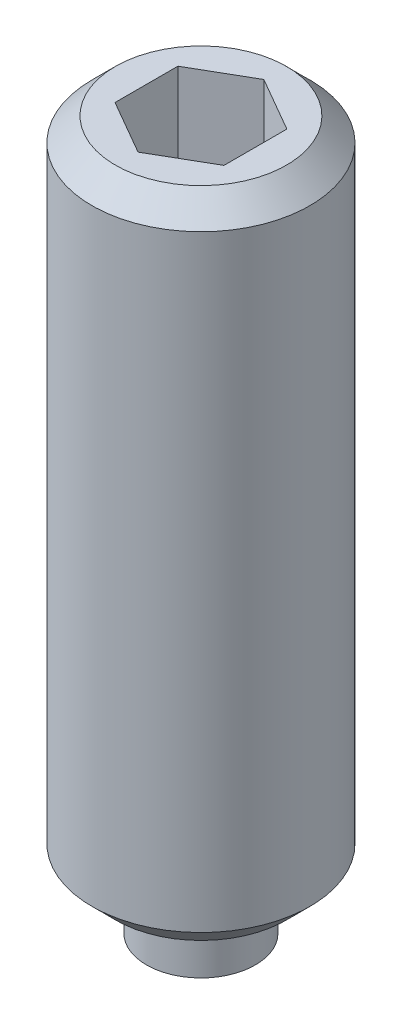
ISO-10303-21;
HEADER;
FILE_DESCRIPTION(('STEP AP214'),'2;1');
FILE_NAME('part.step','',(''),(''),'','','');
FILE_SCHEMA(('AUTOMOTIVE_DESIGN { 1 0 10303 214 1 1 1 1 }'));
ENDSEC;
DATA;
#1=APPLICATION_CONTEXT('core data for automotive mechanical design processes');
#2=APPLICATION_PROTOCOL_DEFINITION('international standard','automotive_design',2000,#1);
#3=PRODUCT_CONTEXT('',#1,'mechanical');
#4=PRODUCT('Part','Part','',(#3));
#5=PRODUCT_RELATED_PRODUCT_CATEGORY('part','',(#4));
#6=PRODUCT_DEFINITION_FORMATION('','',#4);
#7=PRODUCT_DEFINITION_CONTEXT('part definition',#1,'design');
#8=PRODUCT_DEFINITION('design','',#6,#7);
#9=PRODUCT_DEFINITION_SHAPE('','',#8);
#10=(LENGTH_UNIT() NAMED_UNIT(*) SI_UNIT(.MILLI.,.METRE.));
#11=(NAMED_UNIT(*) PLANE_ANGLE_UNIT() SI_UNIT($,.RADIAN.));
#12=(NAMED_UNIT(*) SI_UNIT($,.STERADIAN.) SOLID_ANGLE_UNIT());
#13=UNCERTAINTY_MEASURE_WITH_UNIT(LENGTH_MEASURE(1.E-05),#10,'distance_accuracy_value','');
#14=(GEOMETRIC_REPRESENTATION_CONTEXT(3) GLOBAL_UNCERTAINTY_ASSIGNED_CONTEXT((#13)) GLOBAL_UNIT_ASSIGNED_CONTEXT((#10,
#11,#12)) REPRESENTATION_CONTEXT('',''));
#15=CARTESIAN_POINT('',(0.,0.,0.));
#16=DIRECTION('',(0.,0.,1.));
#17=DIRECTION('',(1.,0.,0.));
#18=AXIS2_PLACEMENT_3D('',#15,#16,#17);
#19=CARTESIAN_POINT('',(0.78525,13.,0.));
#20=DIRECTION('',(0.,1.,0.));
#21=DIRECTION('',(1.,0.,0.));
#22=AXIS2_PLACEMENT_3D('',#19,#20,#21);
#23=PLANE('',#22);
#24=DIRECTION('',(-0.866025403784439,0.,-0.5));
#25=VECTOR('',#24,1.);
#26=CARTESIAN_POINT('',(-0.45553125,13.,0.891699448567465));
#27=LINE('',#26,#25);
#28=CARTESIAN_POINT('',(0.,13.,1.15470053837925));
#29=VERTEX_POINT('',#28);
#30=CARTESIAN_POINT('',(-1.,13.,0.577350269189626));
#31=VERTEX_POINT('',#30);
#32=EDGE_CURVE('E192',#29,#31,#27,.T.);
#33=ORIENTED_EDGE('',*,*,#32,.T.);
#34=DIRECTION('',(0.,0.,-1.));
#35=VECTOR('',#34,1.);
#36=CARTESIAN_POINT('',(-1.,13.,-0.288675134594813));
#37=LINE('',#36,#35);
#38=CARTESIAN_POINT('',(-1.,13.,-0.577350269189626));
#39=VERTEX_POINT('',#38);
#40=EDGE_CURVE('E11',#31,#39,#37,.T.);
#41=ORIENTED_EDGE('',*,*,#40,.T.);
#42=DIRECTION('',(0.866025403784439,0.,-0.5));
#43=VECTOR('',#42,1.);
#44=CARTESIAN_POINT('',(0.04446875,13.,-1.18037458316228));
#45=LINE('',#44,#43);
#46=CARTESIAN_POINT('',(0.,13.,-1.15470053837925));
#47=VERTEX_POINT('',#46);
#48=EDGE_CURVE('E204',#39,#47,#45,.T.);
#49=ORIENTED_EDGE('',*,*,#48,.T.);
#50=DIRECTION('',(0.866025403784439,0.,0.5));
#51=VECTOR('',#50,1.);
#52=CARTESIAN_POINT('',(1.04446875,13.,-0.5516762244066));
#53=LINE('',#52,#51);
#54=CARTESIAN_POINT('',(1.,13.,-0.577350269189626));
#55=VERTEX_POINT('',#54);
#56=EDGE_CURVE('E137',#47,#55,#53,.T.);
#57=ORIENTED_EDGE('',*,*,#56,.T.);
#58=DIRECTION('',(0.,0.,1.));
#59=VECTOR('',#58,1.);
#60=CARTESIAN_POINT('',(1.,13.,0.288675134594813));
#61=LINE('',#60,#59);
#62=CARTESIAN_POINT('',(1.,13.,0.577350269189626));
#63=VERTEX_POINT('',#62);
#64=EDGE_CURVE('E183',#55,#63,#61,.T.);
#65=ORIENTED_EDGE('',*,*,#64,.T.);
#66=DIRECTION('',(-0.866025403784439,0.,0.5));
#67=VECTOR('',#66,1.);
#68=CARTESIAN_POINT('',(0.54446875,13.,0.840351359001412));
#69=LINE('',#68,#67);
#70=EDGE_CURVE('E182',#63,#29,#69,.T.);
#71=ORIENTED_EDGE('',*,*,#70,.T.);
#72=EDGE_LOOP('',(#33,#41,#49,#57,#65,#71));
#73=FACE_BOUND('',#72,.T.);
#74=CARTESIAN_POINT('',(0.,13.,0.));
#75=DIRECTION('',(0.,1.,0.));
#76=DIRECTION('',(1.,0.,0.));
#77=AXIS2_PLACEMENT_3D('',#74,#75,#76);
#78=CIRCLE('',#77,1.5705);
#79=CARTESIAN_POINT('',(-1.5705,13.,0.));
#80=VERTEX_POINT('',#79);
#81=EDGE_CURVE('E210',#80,#80,#78,.T.);
#82=ORIENTED_EDGE('',*,*,#81,.T.);
#83=EDGE_LOOP('',(#82));
#84=FACE_BOUND('',#83,.T.);
#85=ADVANCED_FACE('F16',(#73,#84),#23,.T.);
#86=CARTESIAN_POINT('',(1.28525,1.,0.));
#87=DIRECTION('',(0.,-1.,0.));
#88=DIRECTION('',(0.,0.,-1.));
#89=AXIS2_PLACEMENT_3D('',#86,#87,#88);
#90=PLANE('',#89);
#91=CARTESIAN_POINT('',(0.,1.,0.));
#92=DIRECTION('',(0.,1.,0.));
#93=DIRECTION('',(1.,0.,0.));
#94=AXIS2_PLACEMENT_3D('',#91,#92,#93);
#95=CIRCLE('',#94,1.);
#96=CARTESIAN_POINT('',(-1.,1.,0.));
#97=VERTEX_POINT('',#96);
#98=EDGE_CURVE('E107',#97,#97,#95,.T.);
#99=ORIENTED_EDGE('',*,*,#98,.T.);
#100=EDGE_LOOP('',(#99));
#101=FACE_BOUND('',#100,.T.);
#102=CARTESIAN_POINT('',(0.,1.,0.));
#103=DIRECTION('',(0.,1.,0.));
#104=DIRECTION('',(1.,0.,0.));
#105=AXIS2_PLACEMENT_3D('',#102,#103,#104);
#106=CIRCLE('',#105,1.5705);
#107=CARTESIAN_POINT('',(-1.5705,1.,0.));
#108=VERTEX_POINT('',#107);
#109=EDGE_CURVE('E116',#108,#108,#106,.T.);
#110=ORIENTED_EDGE('',*,*,#109,.F.);
#111=EDGE_LOOP('',(#110));
#112=FACE_BOUND('',#111,.T.);
#113=ADVANCED_FACE('F264',(#101,#112),#90,.T.);
#114=CARTESIAN_POINT('',(0.5,0.,0.));
#115=DIRECTION('',(0.,-1.,0.));
#116=DIRECTION('',(0.,0.,-1.));
#117=AXIS2_PLACEMENT_3D('',#114,#115,#116);
#118=PLANE('',#117);
#119=CARTESIAN_POINT('',(0.,0.,0.));
#120=DIRECTION('',(0.,1.,0.));
#121=DIRECTION('',(1.,0.,0.));
#122=AXIS2_PLACEMENT_3D('',#119,#120,#121);
#123=CIRCLE('',#122,1.);
#124=CARTESIAN_POINT('',(-1.,0.,0.));
#125=VERTEX_POINT('',#124);
#126=EDGE_CURVE('E101',#125,#125,#123,.T.);
#127=ORIENTED_EDGE('',*,*,#126,.F.);
#128=EDGE_LOOP('',(#127));
#129=FACE_BOUND('',#128,.T.);
#130=ADVANCED_FACE('F269',(#129),#118,.T.);
#131=CARTESIAN_POINT('',(-1.,15.,-0.577350269189626));
#132=DIRECTION('',(-1.,0.,0.));
#133=DIRECTION('',(0.,0.,1.));
#134=AXIS2_PLACEMENT_3D('',#131,#132,#133);
#135=PLANE('',#134);
#136=ORIENTED_EDGE('',*,*,#40,.F.);
#137=DIRECTION('',(0.,-1.,0.));
#138=VECTOR('',#137,1.);
#139=CARTESIAN_POINT('',(-1.,15.,0.577350269189626));
#140=LINE('',#139,#138);
#141=CARTESIAN_POINT('',(-1.,11.,0.577350269189626));
#142=VERTEX_POINT('',#141);
#143=EDGE_CURVE('E201',#31,#142,#140,.T.);
#144=ORIENTED_EDGE('',*,*,#143,.T.);
#145=DIRECTION('',(0.,0.,1.));
#146=VECTOR('',#145,1.);
#147=CARTESIAN_POINT('',(-1.,11.,-0.577350269189626));
#148=LINE('',#147,#146);
#149=CARTESIAN_POINT('',(-1.,11.,0.));
#150=VERTEX_POINT('',#149);
#151=EDGE_CURVE('E126',#150,#142,#148,.T.);
#152=ORIENTED_EDGE('',*,*,#151,.F.);
#153=DIRECTION('',(0.,0.,1.));
#154=VECTOR('',#153,1.);
#155=CARTESIAN_POINT('',(-1.,11.,-0.577350269189626));
#156=LINE('',#155,#154);
#157=CARTESIAN_POINT('',(-1.,11.,-0.577350269189626));
#158=VERTEX_POINT('',#157);
#159=EDGE_CURVE('E165',#158,#150,#156,.T.);
#160=ORIENTED_EDGE('',*,*,#159,.F.);
#161=DIRECTION('',(0.,-1.,0.));
#162=VECTOR('',#161,1.);
#163=CARTESIAN_POINT('',(-1.,15.,-0.577350269189626));
#164=LINE('',#163,#162);
#165=EDGE_CURVE('E27',#39,#158,#164,.T.);
#166=ORIENTED_EDGE('',*,*,#165,.F.);
#167=EDGE_LOOP('',(#136,#144,#152,#160,#166));
#168=FACE_BOUND('',#167,.T.);
#169=ADVANCED_FACE('F290',(#168),#135,.F.);
#170=CARTESIAN_POINT('',(0.,15.,-1.15470053837925));
#171=DIRECTION('',(-0.5,0.,-0.866025403784439));
#172=DIRECTION('',(-0.866025403784439,0.,0.5));
#173=AXIS2_PLACEMENT_3D('',#170,#171,#172);
#174=PLANE('',#173);
#175=ORIENTED_EDGE('',*,*,#48,.F.);
#176=ORIENTED_EDGE('',*,*,#165,.T.);
#177=DIRECTION('',(-0.866025403784439,0.,0.5));
#178=VECTOR('',#177,1.);
#179=CARTESIAN_POINT('',(0.,11.,-1.15470053837925));
#180=LINE('',#179,#178);
#181=CARTESIAN_POINT('',(-0.5,11.,-0.866025403784439));
#182=VERTEX_POINT('',#181);
#183=EDGE_CURVE('E176',#182,#158,#180,.T.);
#184=ORIENTED_EDGE('',*,*,#183,.F.);
#185=DIRECTION('',(-0.866025403784439,0.,0.5));
#186=VECTOR('',#185,1.);
#187=CARTESIAN_POINT('',(0.,11.,-1.15470053837925));
#188=LINE('',#187,#186);
#189=CARTESIAN_POINT('',(0.,11.,-1.15470053837925));
#190=VERTEX_POINT('',#189);
#191=EDGE_CURVE('E164',#190,#182,#188,.T.);
#192=ORIENTED_EDGE('',*,*,#191,.F.);
#193=DIRECTION('',(0.,-1.,0.));
#194=VECTOR('',#193,1.);
#195=CARTESIAN_POINT('',(0.,15.,-1.15470053837925));
#196=LINE('',#195,#194);
#197=EDGE_CURVE('E220',#47,#190,#196,.T.);
#198=ORIENTED_EDGE('',*,*,#197,.F.);
#199=EDGE_LOOP('',(#175,#176,#184,#192,#198));
#200=FACE_BOUND('',#199,.T.);
#201=ADVANCED_FACE('F293',(#200),#174,.F.);
#202=CARTESIAN_POINT('',(-1.,15.,0.577350269189626));
#203=DIRECTION('',(-0.5,0.,0.866025403784439));
#204=DIRECTION('',(0.,1.,0.));
#205=AXIS2_PLACEMENT_3D('',#202,#203,#204);
#206=PLANE('',#205);
#207=ORIENTED_EDGE('',*,*,#32,.F.);
#208=DIRECTION('',(0.,-1.,0.));
#209=VECTOR('',#208,1.);
#210=CARTESIAN_POINT('',(0.,15.,1.15470053837925));
#211=LINE('',#210,#209);
#212=CARTESIAN_POINT('',(0.,11.,1.15470053837925));
#213=VERTEX_POINT('',#212);
#214=EDGE_CURVE('E186',#29,#213,#211,.T.);
#215=ORIENTED_EDGE('',*,*,#214,.T.);
#216=DIRECTION('',(0.866025403784439,0.,0.5));
#217=VECTOR('',#216,1.);
#218=CARTESIAN_POINT('',(-1.,11.,0.577350269189626));
#219=LINE('',#218,#217);
#220=CARTESIAN_POINT('',(-0.5,11.,0.866025403784439));
#221=VERTEX_POINT('',#220);
#222=EDGE_CURVE('E141',#221,#213,#219,.T.);
#223=ORIENTED_EDGE('',*,*,#222,.F.);
#224=DIRECTION('',(0.866025403784439,0.,0.5));
#225=VECTOR('',#224,1.);
#226=CARTESIAN_POINT('',(-1.,11.,0.577350269189626));
#227=LINE('',#226,#225);
#228=EDGE_CURVE('E129',#142,#221,#227,.T.);
#229=ORIENTED_EDGE('',*,*,#228,.F.);
#230=ORIENTED_EDGE('',*,*,#143,.F.);
#231=EDGE_LOOP('',(#207,#215,#223,#229,#230));
#232=FACE_BOUND('',#231,.T.);
#233=ADVANCED_FACE('F304',(#232),#206,.F.);
#234=CARTESIAN_POINT('',(0.,15.,1.15470053837925));
#235=DIRECTION('',(0.5,0.,0.866025403784439));
#236=DIRECTION('',(0.,-1.,0.));
#237=AXIS2_PLACEMENT_3D('',#234,#235,#236);
#238=PLANE('',#237);
#239=ORIENTED_EDGE('',*,*,#70,.F.);
#240=DIRECTION('',(0.,-1.,0.));
#241=VECTOR('',#240,1.);
#242=CARTESIAN_POINT('',(1.,15.,0.577350269189626));
#243=LINE('',#242,#241);
#244=CARTESIAN_POINT('',(1.,11.,0.577350269189626));
#245=VERTEX_POINT('',#244);
#246=EDGE_CURVE('E180',#63,#245,#243,.T.);
#247=ORIENTED_EDGE('',*,*,#246,.T.);
#248=DIRECTION('',(0.866025403784439,0.,-0.5));
#249=VECTOR('',#248,1.);
#250=CARTESIAN_POINT('',(0.,11.,1.15470053837925));
#251=LINE('',#250,#249);
#252=CARTESIAN_POINT('',(0.5,11.,0.866025403784439));
#253=VERTEX_POINT('',#252);
#254=EDGE_CURVE('E122',#253,#245,#251,.T.);
#255=ORIENTED_EDGE('',*,*,#254,.F.);
#256=DIRECTION('',(0.866025403784439,0.,-0.5));
#257=VECTOR('',#256,1.);
#258=CARTESIAN_POINT('',(0.,11.,1.15470053837925));
#259=LINE('',#258,#257);
#260=EDGE_CURVE('E130',#213,#253,#259,.T.);
#261=ORIENTED_EDGE('',*,*,#260,.F.);
#262=ORIENTED_EDGE('',*,*,#214,.F.);
#263=EDGE_LOOP('',(#239,#247,#255,#261,#262));
#264=FACE_BOUND('',#263,.T.);
#265=ADVANCED_FACE('F278',(#264),#238,.F.);
#266=CARTESIAN_POINT('',(1.,15.,0.577350269189626));
#267=DIRECTION('',(1.,0.,0.));
#268=DIRECTION('',(0.,1.,0.));
#269=AXIS2_PLACEMENT_3D('',#266,#267,#268);
#270=PLANE('',#269);
#271=ORIENTED_EDGE('',*,*,#64,.F.);
#272=DIRECTION('',(0.,-1.,0.));
#273=VECTOR('',#272,1.);
#274=CARTESIAN_POINT('',(1.,15.,-0.577350269189626));
#275=LINE('',#274,#273);
#276=CARTESIAN_POINT('',(1.,11.,-0.577350269189626));
#277=VERTEX_POINT('',#276);
#278=EDGE_CURVE('E155',#55,#277,#275,.T.);
#279=ORIENTED_EDGE('',*,*,#278,.T.);
#280=DIRECTION('',(0.,0.,-1.));
#281=VECTOR('',#280,1.);
#282=CARTESIAN_POINT('',(1.,11.,0.577350269189626));
#283=LINE('',#282,#281);
#284=CARTESIAN_POINT('',(1.,11.,0.));
#285=VERTEX_POINT('',#284);
#286=EDGE_CURVE('E169',#285,#277,#283,.T.);
#287=ORIENTED_EDGE('',*,*,#286,.F.);
#288=DIRECTION('',(0.,0.,-1.));
#289=VECTOR('',#288,1.);
#290=CARTESIAN_POINT('',(1.,11.,0.577350269189626));
#291=LINE('',#290,#289);
#292=EDGE_CURVE('E124',#245,#285,#291,.T.);
#293=ORIENTED_EDGE('',*,*,#292,.F.);
#294=ORIENTED_EDGE('',*,*,#246,.F.);
#295=EDGE_LOOP('',(#271,#279,#287,#293,#294));
#296=FACE_BOUND('',#295,.T.);
#297=ADVANCED_FACE('F274',(#296),#270,.F.);
#298=CARTESIAN_POINT('',(1.,15.,-0.577350269189626));
#299=DIRECTION('',(0.5,0.,-0.866025403784439));
#300=DIRECTION('',(0.,-1.,0.));
#301=AXIS2_PLACEMENT_3D('',#298,#299,#300);
#302=PLANE('',#301);
#303=ORIENTED_EDGE('',*,*,#56,.F.);
#304=ORIENTED_EDGE('',*,*,#197,.T.);
#305=DIRECTION('',(-0.866025403784439,0.,-0.5));
#306=VECTOR('',#305,1.);
#307=CARTESIAN_POINT('',(1.,11.,-0.577350269189626));
#308=LINE('',#307,#306);
#309=CARTESIAN_POINT('',(0.5,11.,-0.866025403784439));
#310=VERTEX_POINT('',#309);
#311=EDGE_CURVE('E160',#310,#190,#308,.T.);
#312=ORIENTED_EDGE('',*,*,#311,.F.);
#313=DIRECTION('',(-0.866025403784439,0.,-0.5));
#314=VECTOR('',#313,1.);
#315=CARTESIAN_POINT('',(1.,11.,-0.577350269189626));
#316=LINE('',#315,#314);
#317=EDGE_CURVE('E125',#277,#310,#316,.T.);
#318=ORIENTED_EDGE('',*,*,#317,.F.);
#319=ORIENTED_EDGE('',*,*,#278,.F.);
#320=EDGE_LOOP('',(#303,#304,#312,#318,#319));
#321=FACE_BOUND('',#320,.T.);
#322=ADVANCED_FACE('F277',(#321),#302,.F.);
#323=CARTESIAN_POINT('',(0.,11.,0.));
#324=DIRECTION('',(0.,1.,0.));
#325=DIRECTION('',(1.,0.,0.));
#326=AXIS2_PLACEMENT_3D('',#323,#324,#325);
#327=PLANE('',#326);
#328=CARTESIAN_POINT('',(0.,11.,0.));
#329=DIRECTION('',(0.,-1.,0.));
#330=DIRECTION('',(1.,0.,0.));
#331=AXIS2_PLACEMENT_3D('',#328,#329,#330);
#332=CIRCLE('',#331,1.);
#333=EDGE_CURVE('E170',#221,#150,#332,.T.);
#334=ORIENTED_EDGE('',*,*,#333,.T.);
#335=ORIENTED_EDGE('',*,*,#151,.T.);
#336=ORIENTED_EDGE('',*,*,#228,.T.);
#337=EDGE_LOOP('',(#334,#335,#336));
#338=FACE_BOUND('',#337,.T.);
#339=ADVANCED_FACE('F284',(#338),#327,.T.);
#340=CARTESIAN_POINT('',(0.,11.,0.));
#341=DIRECTION('',(0.,1.,0.));
#342=DIRECTION('',(1.,0.,0.));
#343=AXIS2_PLACEMENT_3D('',#340,#341,#342);
#344=PLANE('',#343);
#345=CARTESIAN_POINT('',(0.,11.,0.));
#346=DIRECTION('',(0.,-1.,0.));
#347=DIRECTION('',(1.,0.,0.));
#348=AXIS2_PLACEMENT_3D('',#345,#346,#347);
#349=CIRCLE('',#348,1.);
#350=EDGE_CURVE('E173',#253,#221,#349,.T.);
#351=ORIENTED_EDGE('',*,*,#350,.T.);
#352=ORIENTED_EDGE('',*,*,#222,.T.);
#353=ORIENTED_EDGE('',*,*,#260,.T.);
#354=EDGE_LOOP('',(#351,#352,#353));
#355=FACE_BOUND('',#354,.T.);
#356=ADVANCED_FACE('F280',(#355),#344,.T.);
#357=CARTESIAN_POINT('',(0.,11.,0.));
#358=DIRECTION('',(0.,1.,0.));
#359=DIRECTION('',(1.,0.,0.));
#360=AXIS2_PLACEMENT_3D('',#357,#358,#359);
#361=PLANE('',#360);
#362=CARTESIAN_POINT('',(0.,11.,0.));
#363=DIRECTION('',(0.,-1.,0.));
#364=DIRECTION('',(1.,0.,0.));
#365=AXIS2_PLACEMENT_3D('',#362,#363,#364);
#366=CIRCLE('',#365,1.);
#367=EDGE_CURVE('E106',#285,#253,#366,.T.);
#368=ORIENTED_EDGE('',*,*,#367,.T.);
#369=ORIENTED_EDGE('',*,*,#254,.T.);
#370=ORIENTED_EDGE('',*,*,#292,.T.);
#371=EDGE_LOOP('',(#368,#369,#370));
#372=FACE_BOUND('',#371,.T.);
#373=ADVANCED_FACE('F283',(#372),#361,.T.);
#374=CARTESIAN_POINT('',(0.,11.,0.));
#375=DIRECTION('',(0.,1.,0.));
#376=DIRECTION('',(1.,0.,0.));
#377=AXIS2_PLACEMENT_3D('',#374,#375,#376);
#378=PLANE('',#377);
#379=CARTESIAN_POINT('',(0.,11.,0.));
#380=DIRECTION('',(0.,-1.,0.));
#381=DIRECTION('',(1.,0.,0.));
#382=AXIS2_PLACEMENT_3D('',#379,#380,#381);
#383=CIRCLE('',#382,1.);
#384=EDGE_CURVE('E20',#310,#285,#383,.T.);
#385=ORIENTED_EDGE('',*,*,#384,.T.);
#386=ORIENTED_EDGE('',*,*,#286,.T.);
#387=ORIENTED_EDGE('',*,*,#317,.T.);
#388=EDGE_LOOP('',(#385,#386,#387));
#389=FACE_BOUND('',#388,.T.);
#390=ADVANCED_FACE('F285',(#389),#378,.T.);
#391=CARTESIAN_POINT('',(0.,11.,0.));
#392=DIRECTION('',(0.,1.,0.));
#393=DIRECTION('',(1.,0.,0.));
#394=AXIS2_PLACEMENT_3D('',#391,#392,#393);
#395=PLANE('',#394);
#396=CARTESIAN_POINT('',(0.,11.,0.));
#397=DIRECTION('',(0.,-1.,0.));
#398=DIRECTION('',(1.,0.,0.));
#399=AXIS2_PLACEMENT_3D('',#396,#397,#398);
#400=CIRCLE('',#399,1.);
#401=EDGE_CURVE('E228',#182,#310,#400,.T.);
#402=ORIENTED_EDGE('',*,*,#401,.T.);
#403=ORIENTED_EDGE('',*,*,#311,.T.);
#404=ORIENTED_EDGE('',*,*,#191,.T.);
#405=EDGE_LOOP('',(#402,#403,#404));
#406=FACE_BOUND('',#405,.T.);
#407=ADVANCED_FACE('F288',(#406),#395,.T.);
#408=CARTESIAN_POINT('',(0.,11.,0.));
#409=DIRECTION('',(0.,1.,0.));
#410=DIRECTION('',(1.,0.,0.));
#411=AXIS2_PLACEMENT_3D('',#408,#409,#410);
#412=PLANE('',#411);
#413=CARTESIAN_POINT('',(0.,11.,0.));
#414=DIRECTION('',(0.,-1.,0.));
#415=DIRECTION('',(1.,0.,0.));
#416=AXIS2_PLACEMENT_3D('',#413,#414,#415);
#417=CIRCLE('',#416,1.);
#418=EDGE_CURVE('E120',#150,#182,#417,.T.);
#419=ORIENTED_EDGE('',*,*,#418,.T.);
#420=ORIENTED_EDGE('',*,*,#183,.T.);
#421=ORIENTED_EDGE('',*,*,#159,.T.);
#422=EDGE_LOOP('',(#419,#420,#421));
#423=FACE_BOUND('',#422,.T.);
#424=ADVANCED_FACE('F18',(#423),#412,.T.);
#425=CARTESIAN_POINT('',(0.,10.7113248654052,0.));
#426=DIRECTION('',(0.,1.,0.));
#427=DIRECTION('',(1.,0.,0.));
#428=AXIS2_PLACEMENT_3D('',#425,#426,#427);
#429=CONICAL_SURFACE('',#428,0.5,1.0471975511966);
#430=CARTESIAN_POINT('',(0.,10.4226497308104,0.));
#431=VERTEX_POINT('',#430);
#432=VERTEX_LOOP('',#431);
#433=FACE_BOUND('',#432,.T.);
#434=ORIENTED_EDGE('',*,*,#367,.F.);
#435=ORIENTED_EDGE('',*,*,#384,.F.);
#436=ORIENTED_EDGE('',*,*,#401,.F.);
#437=ORIENTED_EDGE('',*,*,#418,.F.);
#438=ORIENTED_EDGE('',*,*,#333,.F.);
#439=ORIENTED_EDGE('',*,*,#350,.F.);
#440=EDGE_LOOP('',(#434,#435,#436,#437,#438,#439));
#441=FACE_BOUND('',#440,.T.);
#442=ADVANCED_FACE('F259',(#433,#441),#429,.F.);
#443=CARTESIAN_POINT('',(0.,0.5,0.));
#444=DIRECTION('',(0.,-1.,0.));
#445=DIRECTION('',(1.,0.,0.));
#446=AXIS2_PLACEMENT_3D('',#443,#444,#445);
#447=CYLINDRICAL_SURFACE('',#446,1.);
#448=ORIENTED_EDGE('',*,*,#126,.T.);
#449=EDGE_LOOP('',(#448));
#450=FACE_BOUND('',#449,.T.);
#451=ORIENTED_EDGE('',*,*,#98,.F.);
#452=EDGE_LOOP('',(#451));
#453=FACE_BOUND('',#452,.T.);
#454=ADVANCED_FACE('F102',(#450,#453),#447,.T.);
#455=CARTESIAN_POINT('',(0.,1.21475,0.));
#456=DIRECTION('',(0.,1.,0.));
#457=DIRECTION('',(1.,0.,0.));
#458=AXIS2_PLACEMENT_3D('',#455,#456,#457);
#459=CONICAL_SURFACE('',#458,1.78525,0.785398163397447);
#460=ORIENTED_EDGE('',*,*,#109,.T.);
#461=EDGE_LOOP('',(#460));
#462=FACE_BOUND('',#461,.T.);
#463=CARTESIAN_POINT('',(0.,1.4295,0.));
#464=DIRECTION('',(0.,1.,0.));
#465=DIRECTION('',(1.,0.,0.));
#466=AXIS2_PLACEMENT_3D('',#463,#464,#465);
#467=CIRCLE('',#466,2.);
#468=CARTESIAN_POINT('',(-2.,1.4295,0.));
#469=VERTEX_POINT('',#468);
#470=EDGE_CURVE('E159',#469,#469,#467,.T.);
#471=ORIENTED_EDGE('',*,*,#470,.F.);
#472=EDGE_LOOP('',(#471));
#473=FACE_BOUND('',#472,.T.);
#474=ADVANCED_FACE('F248',(#462,#473),#459,.T.);
#475=CARTESIAN_POINT('',(0.,7.,0.));
#476=DIRECTION('',(0.,-1.,0.));
#477=DIRECTION('',(1.,0.,0.));
#478=AXIS2_PLACEMENT_3D('',#475,#476,#477);
#479=CYLINDRICAL_SURFACE('',#478,2.);
#480=ORIENTED_EDGE('',*,*,#470,.T.);
#481=EDGE_LOOP('',(#480));
#482=FACE_BOUND('',#481,.T.);
#483=CARTESIAN_POINT('',(0.,12.5705,0.));
#484=DIRECTION('',(0.,1.,0.));
#485=DIRECTION('',(1.,0.,0.));
#486=AXIS2_PLACEMENT_3D('',#483,#484,#485);
#487=CIRCLE('',#486,2.);
#488=CARTESIAN_POINT('',(-2.,12.5705,0.));
#489=VERTEX_POINT('',#488);
#490=EDGE_CURVE('E212',#489,#489,#487,.T.);
#491=ORIENTED_EDGE('',*,*,#490,.F.);
#492=EDGE_LOOP('',(#491));
#493=FACE_BOUND('',#492,.T.);
#494=ADVANCED_FACE('F245',(#482,#493),#479,.T.);
#495=CARTESIAN_POINT('',(0.,12.78525,0.));
#496=DIRECTION('',(0.,-1.,0.));
#497=DIRECTION('',(1.,0.,0.));
#498=AXIS2_PLACEMENT_3D('',#495,#496,#497);
#499=CONICAL_SURFACE('',#498,1.78525,0.785398163397447);
#500=ORIENTED_EDGE('',*,*,#490,.T.);
#501=EDGE_LOOP('',(#500));
#502=FACE_BOUND('',#501,.T.);
#503=ORIENTED_EDGE('',*,*,#81,.F.);
#504=EDGE_LOOP('',(#503));
#505=FACE_BOUND('',#504,.T.);
#506=ADVANCED_FACE('F257',(#502,#505),#499,.T.);
#507=CLOSED_SHELL('',(#85,#113,#130,#169,#201,#233,#265,#297,#322,#339,#356,#373,#390,#407,#424,
#442,#454,#474,#494,#506));
#508=MANIFOLD_SOLID_BREP('B1',#507);
#509=ADVANCED_BREP_SHAPE_REPRESENTATION('',(#18,#508),#14);
#510=SHAPE_DEFINITION_REPRESENTATION(#9,#509);
ENDSEC;
END-ISO-10303-21;
